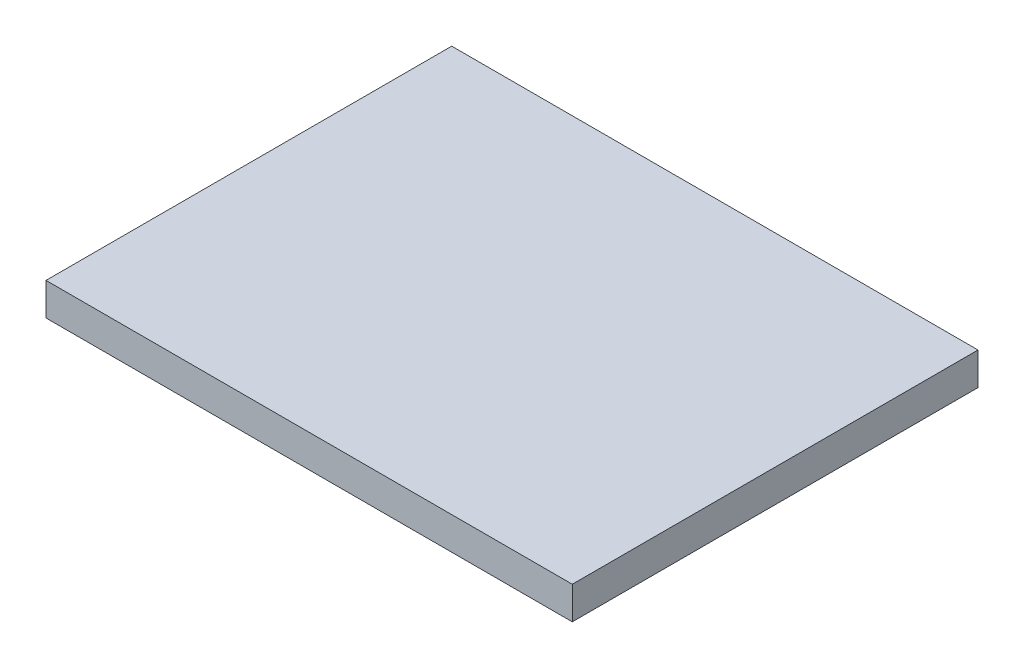
ISO-10303-21;
HEADER;
FILE_DESCRIPTION(('STEP AP214'),'2;1');
FILE_NAME('part.step','',(''),(''),'','','');
FILE_SCHEMA(('AUTOMOTIVE_DESIGN { 1 0 10303 214 1 1 1 1 }'));
ENDSEC;
DATA;
#1=APPLICATION_CONTEXT('core data for automotive mechanical design processes');
#2=APPLICATION_PROTOCOL_DEFINITION('international standard','automotive_design',2000,#1);
#3=PRODUCT_CONTEXT('',#1,'mechanical');
#4=PRODUCT('Part','Part','',(#3));
#5=PRODUCT_RELATED_PRODUCT_CATEGORY('part','',(#4));
#6=PRODUCT_DEFINITION_FORMATION('','',#4);
#7=PRODUCT_DEFINITION_CONTEXT('part definition',#1,'design');
#8=PRODUCT_DEFINITION('design','',#6,#7);
#9=PRODUCT_DEFINITION_SHAPE('','',#8);
#10=(LENGTH_UNIT() NAMED_UNIT(*) SI_UNIT(.MILLI.,.METRE.));
#11=(NAMED_UNIT(*) PLANE_ANGLE_UNIT() SI_UNIT($,.RADIAN.));
#12=(NAMED_UNIT(*) SI_UNIT($,.STERADIAN.) SOLID_ANGLE_UNIT());
#13=UNCERTAINTY_MEASURE_WITH_UNIT(LENGTH_MEASURE(1.E-05),#10,'distance_accuracy_value','');
#14=(GEOMETRIC_REPRESENTATION_CONTEXT(3) GLOBAL_UNCERTAINTY_ASSIGNED_CONTEXT((#13)) GLOBAL_UNIT_ASSIGNED_CONTEXT((#10,
#11,#12)) REPRESENTATION_CONTEXT('',''));
#15=CARTESIAN_POINT('',(0.,0.,0.));
#16=DIRECTION('',(0.,0.,1.));
#17=DIRECTION('',(1.,0.,0.));
#18=AXIS2_PLACEMENT_3D('',#15,#16,#17);
#19=CARTESIAN_POINT('',(161.5,20.,124.5));
#20=DIRECTION('',(-1.,0.,0.));
#21=DIRECTION('',(0.,0.,1.));
#22=AXIS2_PLACEMENT_3D('',#19,#20,#21);
#23=PLANE('',#22);
#24=DIRECTION('',(0.,0.,-1.));
#25=VECTOR('',#24,1.);
#26=CARTESIAN_POINT('',(161.5,0.,124.5));
#27=LINE('',#26,#25);
#28=CARTESIAN_POINT('',(161.5,0.,124.5));
#29=VERTEX_POINT('',#28);
#30=CARTESIAN_POINT('',(161.5,0.,-124.5));
#31=VERTEX_POINT('',#30);
#32=EDGE_CURVE('E107',#29,#31,#27,.T.);
#33=ORIENTED_EDGE('',*,*,#32,.T.);
#34=DIRECTION('',(0.,-1.,0.));
#35=VECTOR('',#34,1.);
#36=CARTESIAN_POINT('',(161.5,20.,-124.5));
#37=LINE('',#36,#35);
#38=CARTESIAN_POINT('',(161.5,20.,-124.5));
#39=VERTEX_POINT('',#38);
#40=EDGE_CURVE('E11',#39,#31,#37,.T.);
#41=ORIENTED_EDGE('',*,*,#40,.F.);
#42=DIRECTION('',(0.,0.,-1.));
#43=VECTOR('',#42,1.);
#44=CARTESIAN_POINT('',(161.5,20.,124.5));
#45=LINE('',#44,#43);
#46=CARTESIAN_POINT('',(161.5,20.,124.5));
#47=VERTEX_POINT('',#46);
#48=EDGE_CURVE('E91',#47,#39,#45,.T.);
#49=ORIENTED_EDGE('',*,*,#48,.F.);
#50=DIRECTION('',(0.,-1.,0.));
#51=VECTOR('',#50,1.);
#52=CARTESIAN_POINT('',(161.5,20.,124.5));
#53=LINE('',#52,#51);
#54=EDGE_CURVE('E103',#47,#29,#53,.T.);
#55=ORIENTED_EDGE('',*,*,#54,.T.);
#56=EDGE_LOOP('',(#33,#41,#49,#55));
#57=FACE_BOUND('',#56,.T.);
#58=ADVANCED_FACE('F39',(#57),#23,.F.);
#59=CARTESIAN_POINT('',(-161.5,20.,-124.5));
#60=DIRECTION('',(0.,0.,1.));
#61=DIRECTION('',(1.,0.,0.));
#62=AXIS2_PLACEMENT_3D('',#59,#60,#61);
#63=PLANE('',#62);
#64=DIRECTION('',(-1.,0.,0.));
#65=VECTOR('',#64,1.);
#66=CARTESIAN_POINT('',(-161.5,0.,-124.5));
#67=LINE('',#66,#65);
#68=CARTESIAN_POINT('',(-161.5,0.,-124.5));
#69=VERTEX_POINT('',#68);
#70=EDGE_CURVE('E96',#31,#69,#67,.T.);
#71=ORIENTED_EDGE('',*,*,#70,.T.);
#72=DIRECTION('',(0.,-1.,0.));
#73=VECTOR('',#72,1.);
#74=CARTESIAN_POINT('',(-161.5,20.,-124.5));
#75=LINE('',#74,#73);
#76=CARTESIAN_POINT('',(-161.5,20.,-124.5));
#77=VERTEX_POINT('',#76);
#78=EDGE_CURVE('E48',#77,#69,#75,.T.);
#79=ORIENTED_EDGE('',*,*,#78,.F.);
#80=DIRECTION('',(-1.,0.,0.));
#81=VECTOR('',#80,1.);
#82=CARTESIAN_POINT('',(-161.5,20.,-124.5));
#83=LINE('',#82,#81);
#84=EDGE_CURVE('E86',#39,#77,#83,.T.);
#85=ORIENTED_EDGE('',*,*,#84,.F.);
#86=ORIENTED_EDGE('',*,*,#40,.T.);
#87=EDGE_LOOP('',(#71,#79,#85,#86));
#88=FACE_BOUND('',#87,.T.);
#89=ADVANCED_FACE('F95',(#88),#63,.F.);
#90=CARTESIAN_POINT('',(-161.5,20.,124.5));
#91=DIRECTION('',(1.,0.,0.));
#92=DIRECTION('',(0.,0.,-1.));
#93=AXIS2_PLACEMENT_3D('',#90,#91,#92);
#94=PLANE('',#93);
#95=DIRECTION('',(0.,0.,1.));
#96=VECTOR('',#95,1.);
#97=CARTESIAN_POINT('',(-161.5,0.,124.5));
#98=LINE('',#97,#96);
#99=CARTESIAN_POINT('',(-161.5,0.,124.5));
#100=VERTEX_POINT('',#99);
#101=EDGE_CURVE('E73',#69,#100,#98,.T.);
#102=ORIENTED_EDGE('',*,*,#101,.T.);
#103=DIRECTION('',(0.,-1.,0.));
#104=VECTOR('',#103,1.);
#105=CARTESIAN_POINT('',(-161.5,20.,124.5));
#106=LINE('',#105,#104);
#107=CARTESIAN_POINT('',(-161.5,20.,124.5));
#108=VERTEX_POINT('',#107);
#109=EDGE_CURVE('E98',#108,#100,#106,.T.);
#110=ORIENTED_EDGE('',*,*,#109,.F.);
#111=DIRECTION('',(0.,0.,1.));
#112=VECTOR('',#111,1.);
#113=CARTESIAN_POINT('',(-161.5,20.,124.5));
#114=LINE('',#113,#112);
#115=EDGE_CURVE('E89',#77,#108,#114,.T.);
#116=ORIENTED_EDGE('',*,*,#115,.F.);
#117=ORIENTED_EDGE('',*,*,#78,.T.);
#118=EDGE_LOOP('',(#102,#110,#116,#117));
#119=FACE_BOUND('',#118,.T.);
#120=ADVANCED_FACE('F99',(#119),#94,.F.);
#121=CARTESIAN_POINT('',(-161.5,20.,124.5));
#122=DIRECTION('',(0.,0.,-1.));
#123=DIRECTION('',(-1.,0.,0.));
#124=AXIS2_PLACEMENT_3D('',#121,#122,#123);
#125=PLANE('',#124);
#126=DIRECTION('',(1.,0.,0.));
#127=VECTOR('',#126,1.);
#128=CARTESIAN_POINT('',(-161.5,0.,124.5));
#129=LINE('',#128,#127);
#130=EDGE_CURVE('E79',#100,#29,#129,.T.);
#131=ORIENTED_EDGE('',*,*,#130,.T.);
#132=ORIENTED_EDGE('',*,*,#54,.F.);
#133=DIRECTION('',(1.,0.,0.));
#134=VECTOR('',#133,1.);
#135=CARTESIAN_POINT('',(-161.5,20.,124.5));
#136=LINE('',#135,#134);
#137=EDGE_CURVE('E56',#108,#47,#136,.T.);
#138=ORIENTED_EDGE('',*,*,#137,.F.);
#139=ORIENTED_EDGE('',*,*,#109,.T.);
#140=EDGE_LOOP('',(#131,#132,#138,#139));
#141=FACE_BOUND('',#140,.T.);
#142=ADVANCED_FACE('F120',(#141),#125,.F.);
#143=CARTESIAN_POINT('',(0.,20.,0.));
#144=DIRECTION('',(0.,-1.,0.));
#145=DIRECTION('',(0.,0.,-1.));
#146=AXIS2_PLACEMENT_3D('',#143,#144,#145);
#147=PLANE('',#146);
#148=ORIENTED_EDGE('',*,*,#48,.T.);
#149=ORIENTED_EDGE('',*,*,#84,.T.);
#150=ORIENTED_EDGE('',*,*,#115,.T.);
#151=ORIENTED_EDGE('',*,*,#137,.T.);
#152=EDGE_LOOP('',(#148,#149,#150,#151));
#153=FACE_BOUND('',#152,.T.);
#154=ADVANCED_FACE('F87',(#153),#147,.F.);
#155=CARTESIAN_POINT('',(0.,0.,0.));
#156=DIRECTION('',(0.,-1.,0.));
#157=DIRECTION('',(0.,0.,-1.));
#158=AXIS2_PLACEMENT_3D('',#155,#156,#157);
#159=PLANE('',#158);
#160=ORIENTED_EDGE('',*,*,#32,.F.);
#161=ORIENTED_EDGE('',*,*,#130,.F.);
#162=ORIENTED_EDGE('',*,*,#101,.F.);
#163=ORIENTED_EDGE('',*,*,#70,.F.);
#164=EDGE_LOOP('',(#160,#161,#162,#163));
#165=FACE_BOUND('',#164,.T.);
#166=ADVANCED_FACE('F123',(#165),#159,.T.);
#167=CLOSED_SHELL('',(#58,#89,#120,#142,#154,#166));
#168=MANIFOLD_SOLID_BREP('B2',#167);
#169=ADVANCED_BREP_SHAPE_REPRESENTATION('',(#18,#168),#14);
#170=SHAPE_DEFINITION_REPRESENTATION(#9,#169);
ENDSEC;
END-ISO-10303-21;
